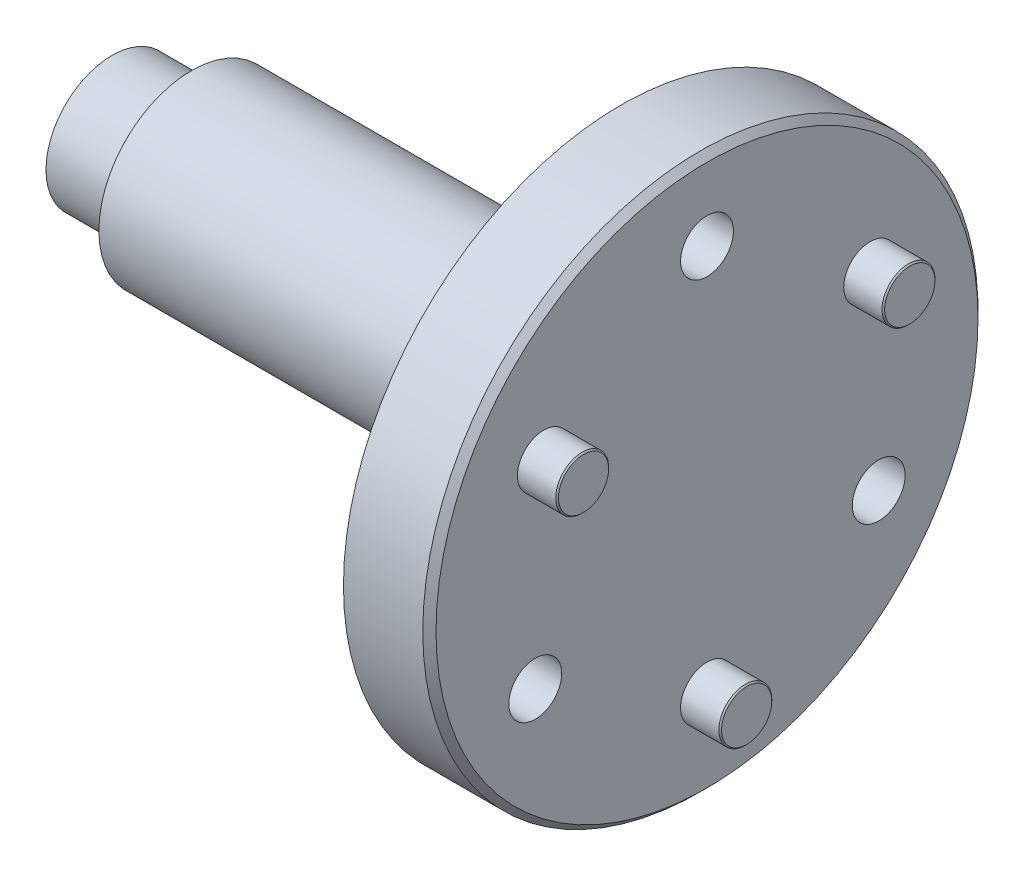
ISO-10303-21;
HEADER;
FILE_DESCRIPTION(('STEP AP214'),'2;1');
FILE_NAME('part.step','',(''),(''),'','','');
FILE_SCHEMA(('AUTOMOTIVE_DESIGN { 1 0 10303 214 1 1 1 1 }'));
ENDSEC;
DATA;
#1=APPLICATION_CONTEXT('core data for automotive mechanical design processes');
#2=APPLICATION_PROTOCOL_DEFINITION('international standard','automotive_design',2000,#1);
#3=PRODUCT_CONTEXT('',#1,'mechanical');
#4=PRODUCT('Part','Part','',(#3));
#5=PRODUCT_RELATED_PRODUCT_CATEGORY('part','',(#4));
#6=PRODUCT_DEFINITION_FORMATION('','',#4);
#7=PRODUCT_DEFINITION_CONTEXT('part definition',#1,'design');
#8=PRODUCT_DEFINITION('design','',#6,#7);
#9=PRODUCT_DEFINITION_SHAPE('','',#8);
#10=(LENGTH_UNIT() NAMED_UNIT(*) SI_UNIT(.MILLI.,.METRE.));
#11=(NAMED_UNIT(*) PLANE_ANGLE_UNIT() SI_UNIT($,.RADIAN.));
#12=(NAMED_UNIT(*) SI_UNIT($,.STERADIAN.) SOLID_ANGLE_UNIT());
#13=UNCERTAINTY_MEASURE_WITH_UNIT(LENGTH_MEASURE(1.E-05),#10,'distance_accuracy_value','');
#14=(GEOMETRIC_REPRESENTATION_CONTEXT(3) GLOBAL_UNCERTAINTY_ASSIGNED_CONTEXT((#13)) GLOBAL_UNIT_ASSIGNED_CONTEXT((#10,
#11,#12)) REPRESENTATION_CONTEXT('',''));
#15=CARTESIAN_POINT('',(0.,0.,0.));
#16=DIRECTION('',(0.,0.,1.));
#17=DIRECTION('',(1.,0.,0.));
#18=AXIS2_PLACEMENT_3D('',#15,#16,#17);
#19=CARTESIAN_POINT('',(-22.25,0.,0.));
#20=DIRECTION('',(1.,0.,0.));
#21=DIRECTION('',(0.,0.,-1.));
#22=AXIS2_PLACEMENT_3D('',#19,#20,#21);
#23=PLANE('',#22);
#24=CARTESIAN_POINT('',(-22.25,0.,0.));
#25=DIRECTION('',(-1.,0.,0.));
#26=DIRECTION('',(0.,0.,1.));
#27=AXIS2_PLACEMENT_3D('',#24,#25,#26);
#28=CIRCLE('',#27,5.);
#29=CARTESIAN_POINT('',(-22.25,0.,5.));
#30=VERTEX_POINT('',#29);
#31=EDGE_CURVE('E100',#30,#30,#28,.T.);
#32=ORIENTED_EDGE('',*,*,#31,.T.);
#33=EDGE_LOOP('',(#32));
#34=FACE_BOUND('',#33,.T.);
#35=ADVANCED_FACE('F45',(#34),#23,.F.);
#36=CARTESIAN_POINT('',(-54.0782024571697,0.,0.));
#37=DIRECTION('',(-1.,0.,0.));
#38=DIRECTION('',(0.,0.,1.));
#39=AXIS2_PLACEMENT_3D('',#36,#37,#38);
#40=CYLINDRICAL_SURFACE('',#39,5.);
#41=ORIENTED_EDGE('',*,*,#31,.F.);
#42=EDGE_LOOP('',(#41));
#43=FACE_BOUND('',#42,.T.);
#44=CARTESIAN_POINT('',(-16.25,0.,0.));
#45=DIRECTION('',(-1.,0.,0.));
#46=DIRECTION('',(0.,0.,1.));
#47=AXIS2_PLACEMENT_3D('',#44,#45,#46);
#48=CIRCLE('',#47,5.);
#49=CARTESIAN_POINT('',(-16.25,0.,5.));
#50=VERTEX_POINT('',#49);
#51=EDGE_CURVE('E104',#50,#50,#48,.T.);
#52=ORIENTED_EDGE('',*,*,#51,.T.);
#53=EDGE_LOOP('',(#52));
#54=FACE_BOUND('',#53,.T.);
#55=ADVANCED_FACE('F182',(#43,#54),#40,.T.);
#56=CARTESIAN_POINT('',(-16.25,5.,0.));
#57=DIRECTION('',(1.,0.,0.));
#58=DIRECTION('',(0.,0.,-1.));
#59=AXIS2_PLACEMENT_3D('',#56,#57,#58);
#60=PLANE('',#59);
#61=ORIENTED_EDGE('',*,*,#51,.F.);
#62=EDGE_LOOP('',(#61));
#63=FACE_BOUND('',#62,.T.);
#64=CARTESIAN_POINT('',(-16.25,0.,0.));
#65=DIRECTION('',(-1.,0.,0.));
#66=DIRECTION('',(0.,0.,1.));
#67=AXIS2_PLACEMENT_3D('',#64,#65,#66);
#68=CIRCLE('',#67,7.);
#69=CARTESIAN_POINT('',(-16.25,0.,7.));
#70=VERTEX_POINT('',#69);
#71=EDGE_CURVE('E108',#70,#70,#68,.T.);
#72=ORIENTED_EDGE('',*,*,#71,.T.);
#73=EDGE_LOOP('',(#72));
#74=FACE_BOUND('',#73,.T.);
#75=ADVANCED_FACE('F176',(#63,#74),#60,.F.);
#76=CARTESIAN_POINT('',(-54.0782024571697,0.,0.));
#77=DIRECTION('',(-1.,0.,0.));
#78=DIRECTION('',(0.,0.,1.));
#79=AXIS2_PLACEMENT_3D('',#76,#77,#78);
#80=CYLINDRICAL_SURFACE('',#79,7.);
#81=ORIENTED_EDGE('',*,*,#71,.F.);
#82=EDGE_LOOP('',(#81));
#83=FACE_BOUND('',#82,.T.);
#84=CARTESIAN_POINT('',(16.25,0.,0.));
#85=DIRECTION('',(-1.,0.,0.));
#86=DIRECTION('',(0.,0.,1.));
#87=AXIS2_PLACEMENT_3D('',#84,#85,#86);
#88=CIRCLE('',#87,7.);
#89=CARTESIAN_POINT('',(16.25,0.,7.));
#90=VERTEX_POINT('',#89);
#91=EDGE_CURVE('E111',#90,#90,#88,.T.);
#92=ORIENTED_EDGE('',*,*,#91,.T.);
#93=EDGE_LOOP('',(#92));
#94=FACE_BOUND('',#93,.T.);
#95=ADVANCED_FACE('F171',(#83,#94),#80,.T.);
#96=CARTESIAN_POINT('',(16.25,7.,0.));
#97=DIRECTION('',(1.,0.,0.));
#98=DIRECTION('',(0.,0.,-1.));
#99=AXIS2_PLACEMENT_3D('',#96,#97,#98);
#100=PLANE('',#99);
#101=CARTESIAN_POINT('',(16.25,-7.50000000000006,-12.9903810567665));
#102=DIRECTION('',(1.,0.,0.));
#103=DIRECTION('',(0.,0.,-1.));
#104=AXIS2_PLACEMENT_3D('',#101,#102,#103);
#105=CIRCLE('',#104,2.);
#106=CARTESIAN_POINT('',(16.25,-7.50000000000006,-14.9903810567665));
#107=VERTEX_POINT('',#106);
#108=EDGE_CURVE('E126',#107,#107,#105,.F.);
#109=ORIENTED_EDGE('',*,*,#108,.F.);
#110=EDGE_LOOP('',(#109));
#111=FACE_BOUND('',#110,.T.);
#112=CARTESIAN_POINT('',(16.25,-7.49999999999988,12.9903810567666));
#113=DIRECTION('',(1.,0.,0.));
#114=DIRECTION('',(0.,0.,-1.));
#115=AXIS2_PLACEMENT_3D('',#112,#113,#114);
#116=CIRCLE('',#115,2.);
#117=CARTESIAN_POINT('',(16.25,-7.49999999999988,10.9903810567666));
#118=VERTEX_POINT('',#117);
#119=EDGE_CURVE('E127',#118,#118,#116,.F.);
#120=ORIENTED_EDGE('',*,*,#119,.F.);
#121=EDGE_LOOP('',(#120));
#122=FACE_BOUND('',#121,.T.);
#123=CARTESIAN_POINT('',(16.25,15.,0.));
#124=DIRECTION('',(1.,0.,0.));
#125=DIRECTION('',(0.,0.,-1.));
#126=AXIS2_PLACEMENT_3D('',#123,#124,#125);
#127=CIRCLE('',#126,2.);
#128=CARTESIAN_POINT('',(16.25,15.,-2.));
#129=VERTEX_POINT('',#128);
#130=EDGE_CURVE('E119',#129,#129,#127,.F.);
#131=ORIENTED_EDGE('',*,*,#130,.F.);
#132=EDGE_LOOP('',(#131));
#133=FACE_BOUND('',#132,.T.);
#134=ORIENTED_EDGE('',*,*,#91,.F.);
#135=EDGE_LOOP('',(#134));
#136=FACE_BOUND('',#135,.T.);
#137=CARTESIAN_POINT('',(16.25,0.,0.));
#138=DIRECTION('',(-1.,0.,0.));
#139=DIRECTION('',(0.,0.,1.));
#140=AXIS2_PLACEMENT_3D('',#137,#138,#139);
#141=CIRCLE('',#140,21.);
#142=CARTESIAN_POINT('',(16.25,0.,21.));
#143=VERTEX_POINT('',#142);
#144=EDGE_CURVE('E115',#143,#143,#141,.T.);
#145=ORIENTED_EDGE('',*,*,#144,.T.);
#146=EDGE_LOOP('',(#145));
#147=FACE_BOUND('',#146,.T.);
#148=ADVANCED_FACE('F166',(#111,#122,#133,#136,#147),#100,.F.);
#149=CARTESIAN_POINT('',(-54.0782024571697,0.,0.));
#150=DIRECTION('',(-1.,0.,0.));
#151=DIRECTION('',(0.,0.,1.));
#152=AXIS2_PLACEMENT_3D('',#149,#150,#151);
#153=CYLINDRICAL_SURFACE('',#152,21.);
#154=CARTESIAN_POINT('',(22.25,0.,0.));
#155=DIRECTION('',(-1.,0.,0.));
#156=DIRECTION('',(0.,0.,1.));
#157=AXIS2_PLACEMENT_3D('',#154,#155,#156);
#158=CIRCLE('',#157,21.);
#159=CARTESIAN_POINT('',(22.25,0.,21.));
#160=VERTEX_POINT('',#159);
#161=EDGE_CURVE('E96',#160,#160,#158,.T.);
#162=ORIENTED_EDGE('',*,*,#161,.T.);
#163=EDGE_LOOP('',(#162));
#164=FACE_BOUND('',#163,.T.);
#165=ORIENTED_EDGE('',*,*,#144,.F.);
#166=EDGE_LOOP('',(#165));
#167=FACE_BOUND('',#166,.T.);
#168=ADVANCED_FACE('F149',(#164,#167),#153,.T.);
#169=CARTESIAN_POINT('',(22.75,21.,0.));
#170=DIRECTION('',(-1.,0.,0.));
#171=DIRECTION('',(0.,0.,1.));
#172=AXIS2_PLACEMENT_3D('',#169,#170,#171);
#173=PLANE('',#172);
#174=CARTESIAN_POINT('',(22.75,-14.25,-2.02095284951298E-13));
#175=DIRECTION('',(-1.,0.,0.));
#176=DIRECTION('',(0.,0.,1.));
#177=AXIS2_PLACEMENT_3D('',#174,#175,#176);
#178=CIRCLE('',#177,2.);
#179=CARTESIAN_POINT('',(22.75,-14.25,1.9999999999998));
#180=VERTEX_POINT('',#179);
#181=EDGE_CURVE('E74',#180,#180,#178,.F.);
#182=ORIENTED_EDGE('',*,*,#181,.F.);
#183=EDGE_LOOP('',(#182));
#184=FACE_BOUND('',#183,.T.);
#185=CARTESIAN_POINT('',(22.75,7.12499999999988,12.3408620039283));
#186=DIRECTION('',(-1.,0.,0.));
#187=DIRECTION('',(0.,0.,1.));
#188=AXIS2_PLACEMENT_3D('',#185,#186,#187);
#189=CIRCLE('',#188,2.);
#190=CARTESIAN_POINT('',(22.75,7.12499999999988,14.3408620039283));
#191=VERTEX_POINT('',#190);
#192=EDGE_CURVE('E78',#191,#191,#189,.F.);
#193=ORIENTED_EDGE('',*,*,#192,.F.);
#194=EDGE_LOOP('',(#193));
#195=FACE_BOUND('',#194,.T.);
#196=CARTESIAN_POINT('',(22.75,7.12500000000006,-12.3408620039282));
#197=DIRECTION('',(-1.,0.,0.));
#198=DIRECTION('',(0.,0.,1.));
#199=AXIS2_PLACEMENT_3D('',#196,#197,#198);
#200=CIRCLE('',#199,2.);
#201=CARTESIAN_POINT('',(22.75,7.12500000000006,-10.3408620039282));
#202=VERTEX_POINT('',#201);
#203=EDGE_CURVE('E88',#202,#202,#200,.F.);
#204=ORIENTED_EDGE('',*,*,#203,.F.);
#205=EDGE_LOOP('',(#204));
#206=FACE_BOUND('',#205,.T.);
#207=CARTESIAN_POINT('',(22.75,-7.50000000000006,-12.9903810567665));
#208=DIRECTION('',(1.,0.,0.));
#209=DIRECTION('',(0.,-0.866025403784436,0.500000000000004));
#210=AXIS2_PLACEMENT_3D('',#207,#208,#209);
#211=CIRCLE('',#210,2.);
#212=CARTESIAN_POINT('',(22.75,-9.23205080756893,-11.9903810567665));
#213=VERTEX_POINT('',#212);
#214=EDGE_CURVE('E131',#213,#213,#211,.T.);
#215=ORIENTED_EDGE('',*,*,#214,.F.);
#216=EDGE_LOOP('',(#215));
#217=FACE_BOUND('',#216,.T.);
#218=CARTESIAN_POINT('',(22.75,-7.49999999999988,12.9903810567666));
#219=DIRECTION('',(1.,0.,0.));
#220=DIRECTION('',(0.,0.866025403784443,0.499999999999992));
#221=AXIS2_PLACEMENT_3D('',#218,#219,#220);
#222=CIRCLE('',#221,2.);
#223=CARTESIAN_POINT('',(22.75,-5.76794919243099,13.9903810567666));
#224=VERTEX_POINT('',#223);
#225=EDGE_CURVE('E132',#224,#224,#222,.T.);
#226=ORIENTED_EDGE('',*,*,#225,.F.);
#227=EDGE_LOOP('',(#226));
#228=FACE_BOUND('',#227,.T.);
#229=CARTESIAN_POINT('',(22.75,15.,0.));
#230=DIRECTION('',(1.,0.,0.));
#231=DIRECTION('',(0.,0.,-1.));
#232=AXIS2_PLACEMENT_3D('',#229,#230,#231);
#233=CIRCLE('',#232,2.);
#234=CARTESIAN_POINT('',(22.75,15.,-2.));
#235=VERTEX_POINT('',#234);
#236=EDGE_CURVE('E123',#235,#235,#233,.T.);
#237=ORIENTED_EDGE('',*,*,#236,.F.);
#238=EDGE_LOOP('',(#237));
#239=FACE_BOUND('',#238,.T.);
#240=CARTESIAN_POINT('',(22.75,0.,0.));
#241=DIRECTION('',(-1.,0.,0.));
#242=DIRECTION('',(0.,0.,1.));
#243=AXIS2_PLACEMENT_3D('',#240,#241,#242);
#244=CIRCLE('',#243,20.5);
#245=CARTESIAN_POINT('',(22.75,0.,20.5));
#246=VERTEX_POINT('',#245);
#247=EDGE_CURVE('E92',#246,#246,#244,.F.);
#248=ORIENTED_EDGE('',*,*,#247,.T.);
#249=EDGE_LOOP('',(#248));
#250=FACE_BOUND('',#249,.T.);
#251=ADVANCED_FACE('F145',(#184,#195,#206,#217,#228,#239,#250),#173,.F.);
#252=CARTESIAN_POINT('',(22.25,0.,0.));
#253=DIRECTION('',(-1.,0.,0.));
#254=DIRECTION('',(0.,0.,1.));
#255=AXIS2_PLACEMENT_3D('',#252,#253,#254);
#256=CONICAL_SURFACE('',#255,21.,0.785398163397448);
#257=ORIENTED_EDGE('',*,*,#247,.F.);
#258=EDGE_LOOP('',(#257));
#259=FACE_BOUND('',#258,.T.);
#260=ORIENTED_EDGE('',*,*,#161,.F.);
#261=EDGE_LOOP('',(#260));
#262=FACE_BOUND('',#261,.T.);
#263=ADVANCED_FACE('F148',(#259,#262),#256,.T.);
#264=CARTESIAN_POINT('',(10.5931457505076,15.,0.));
#265=DIRECTION('',(1.,0.,0.));
#266=DIRECTION('',(0.,0.,-1.));
#267=AXIS2_PLACEMENT_3D('',#264,#265,#266);
#268=CYLINDRICAL_SURFACE('',#267,2.);
#269=ORIENTED_EDGE('',*,*,#130,.T.);
#270=EDGE_LOOP('',(#269));
#271=FACE_BOUND('',#270,.T.);
#272=ORIENTED_EDGE('',*,*,#236,.T.);
#273=EDGE_LOOP('',(#272));
#274=FACE_BOUND('',#273,.T.);
#275=ADVANCED_FACE('F160',(#271,#274),#268,.F.);
#276=CARTESIAN_POINT('',(10.5931457505076,-7.49999999999988,12.9903810567666));
#277=DIRECTION('',(1.,0.,0.));
#278=DIRECTION('',(0.,0.,-1.));
#279=AXIS2_PLACEMENT_3D('',#276,#277,#278);
#280=CYLINDRICAL_SURFACE('',#279,2.);
#281=ORIENTED_EDGE('',*,*,#119,.T.);
#282=EDGE_LOOP('',(#281));
#283=FACE_BOUND('',#282,.T.);
#284=ORIENTED_EDGE('',*,*,#225,.T.);
#285=EDGE_LOOP('',(#284));
#286=FACE_BOUND('',#285,.T.);
#287=ADVANCED_FACE('F238',(#283,#286),#280,.F.);
#288=CARTESIAN_POINT('',(10.5931457505076,-7.50000000000006,-12.9903810567665));
#289=DIRECTION('',(1.,0.,0.));
#290=DIRECTION('',(0.,0.,-1.));
#291=AXIS2_PLACEMENT_3D('',#288,#289,#290);
#292=CYLINDRICAL_SURFACE('',#291,2.);
#293=ORIENTED_EDGE('',*,*,#108,.T.);
#294=EDGE_LOOP('',(#293));
#295=FACE_BOUND('',#294,.T.);
#296=ORIENTED_EDGE('',*,*,#214,.T.);
#297=EDGE_LOOP('',(#296));
#298=FACE_BOUND('',#297,.T.);
#299=ADVANCED_FACE('F143',(#295,#298),#292,.F.);
#300=CARTESIAN_POINT('',(25.75,7.12500000000006,-12.3408620039282));
#301=DIRECTION('',(-1.,0.,0.));
#302=DIRECTION('',(0.,0.,1.));
#303=AXIS2_PLACEMENT_3D('',#300,#301,#302);
#304=CYLINDRICAL_SURFACE('',#303,2.);
#305=CARTESIAN_POINT('',(25.65,7.12500000000006,-12.3408620039282));
#306=DIRECTION('',(1.,0.,0.));
#307=DIRECTION('',(0.,0.,-1.));
#308=AXIS2_PLACEMENT_3D('',#305,#306,#307);
#309=CIRCLE('',#308,2.);
#310=CARTESIAN_POINT('',(25.65,7.12500000000006,-14.3408620039282));
#311=VERTEX_POINT('',#310);
#312=EDGE_CURVE('E82',#311,#311,#309,.F.);
#313=ORIENTED_EDGE('',*,*,#312,.T.);
#314=EDGE_LOOP('',(#313));
#315=FACE_BOUND('',#314,.T.);
#316=ORIENTED_EDGE('',*,*,#203,.T.);
#317=EDGE_LOOP('',(#316));
#318=FACE_BOUND('',#317,.T.);
#319=ADVANCED_FACE('F231',(#315,#318),#304,.T.);
#320=CARTESIAN_POINT('',(25.75,7.12500000000006,-12.3408620039282));
#321=DIRECTION('',(1.,0.,0.));
#322=DIRECTION('',(0.,0.,-1.));
#323=AXIS2_PLACEMENT_3D('',#320,#321,#322);
#324=PLANE('',#323);
#325=CARTESIAN_POINT('',(25.75,7.12500000000006,-12.3408620039282));
#326=DIRECTION('',(1.,0.,0.));
#327=DIRECTION('',(0.,0.,-1.));
#328=AXIS2_PLACEMENT_3D('',#325,#326,#327);
#329=CIRCLE('',#328,1.90000000000001);
#330=CARTESIAN_POINT('',(25.75,7.12500000000006,-14.2408620039282));
#331=VERTEX_POINT('',#330);
#332=EDGE_CURVE('E85',#331,#331,#329,.T.);
#333=ORIENTED_EDGE('',*,*,#332,.T.);
#334=EDGE_LOOP('',(#333));
#335=FACE_BOUND('',#334,.T.);
#336=ADVANCED_FACE('F201',(#335),#324,.T.);
#337=CARTESIAN_POINT('',(25.75,7.12500000000006,-12.3408620039282));
#338=DIRECTION('',(-1.,0.,0.));
#339=DIRECTION('',(0.,0.,1.));
#340=AXIS2_PLACEMENT_3D('',#337,#338,#339);
#341=CONICAL_SURFACE('',#340,1.90000000000001,0.78539816339749);
#342=ORIENTED_EDGE('',*,*,#312,.F.);
#343=EDGE_LOOP('',(#342));
#344=FACE_BOUND('',#343,.T.);
#345=ORIENTED_EDGE('',*,*,#332,.F.);
#346=EDGE_LOOP('',(#345));
#347=FACE_BOUND('',#346,.T.);
#348=ADVANCED_FACE('F195',(#344,#347),#341,.T.);
#349=CARTESIAN_POINT('',(25.75,7.12499999999988,12.3408620039283));
#350=DIRECTION('',(-1.,0.,0.));
#351=DIRECTION('',(0.,0.,1.));
#352=AXIS2_PLACEMENT_3D('',#349,#350,#351);
#353=CYLINDRICAL_SURFACE('',#352,2.);
#354=CARTESIAN_POINT('',(25.65,7.12499999999988,12.3408620039283));
#355=DIRECTION('',(1.,0.,0.));
#356=DIRECTION('',(0.,0.,-1.));
#357=AXIS2_PLACEMENT_3D('',#354,#355,#356);
#358=CIRCLE('',#357,2.);
#359=CARTESIAN_POINT('',(25.65,7.12499999999988,10.3408620039283));
#360=VERTEX_POINT('',#359);
#361=EDGE_CURVE('E61',#360,#360,#358,.F.);
#362=ORIENTED_EDGE('',*,*,#361,.T.);
#363=EDGE_LOOP('',(#362));
#364=FACE_BOUND('',#363,.T.);
#365=ORIENTED_EDGE('',*,*,#192,.T.);
#366=EDGE_LOOP('',(#365));
#367=FACE_BOUND('',#366,.T.);
#368=ADVANCED_FACE('F200',(#364,#367),#353,.T.);
#369=CARTESIAN_POINT('',(25.75,7.12499999999988,12.3408620039283));
#370=DIRECTION('',(1.,0.,0.));
#371=DIRECTION('',(0.,0.866025403784436,0.500000000000004));
#372=AXIS2_PLACEMENT_3D('',#369,#370,#371);
#373=PLANE('',#372);
#374=CARTESIAN_POINT('',(25.75,7.12499999999988,12.3408620039283));
#375=DIRECTION('',(1.,0.,0.));
#376=DIRECTION('',(0.,0.,-1.));
#377=AXIS2_PLACEMENT_3D('',#374,#375,#376);
#378=CIRCLE('',#377,1.90000000000001);
#379=CARTESIAN_POINT('',(25.75,7.12499999999988,10.4408620039283));
#380=VERTEX_POINT('',#379);
#381=EDGE_CURVE('E68',#380,#380,#378,.T.);
#382=ORIENTED_EDGE('',*,*,#381,.T.);
#383=EDGE_LOOP('',(#382));
#384=FACE_BOUND('',#383,.T.);
#385=ADVANCED_FACE('F219',(#384),#373,.T.);
#386=CARTESIAN_POINT('',(25.75,-14.25,-2.02095284951298E-13));
#387=DIRECTION('',(-1.,0.,0.));
#388=DIRECTION('',(0.,0.,1.));
#389=AXIS2_PLACEMENT_3D('',#386,#387,#388);
#390=CYLINDRICAL_SURFACE('',#389,2.);
#391=CARTESIAN_POINT('',(25.65,-14.25,-2.02095284951298E-13));
#392=DIRECTION('',(1.,0.,0.));
#393=DIRECTION('',(0.,0.,-1.));
#394=AXIS2_PLACEMENT_3D('',#391,#392,#393);
#395=CIRCLE('',#394,2.);
#396=CARTESIAN_POINT('',(25.65,-14.25,-2.0000000000002));
#397=VERTEX_POINT('',#396);
#398=EDGE_CURVE('E10',#397,#397,#395,.F.);
#399=ORIENTED_EDGE('',*,*,#398,.T.);
#400=EDGE_LOOP('',(#399));
#401=FACE_BOUND('',#400,.T.);
#402=ORIENTED_EDGE('',*,*,#181,.T.);
#403=EDGE_LOOP('',(#402));
#404=FACE_BOUND('',#403,.T.);
#405=ADVANCED_FACE('F213',(#401,#404),#390,.T.);
#406=CARTESIAN_POINT('',(25.75,-14.25,-2.02095284951298E-13));
#407=DIRECTION('',(1.,0.,0.));
#408=DIRECTION('',(0.,-0.866025403784443,0.499999999999992));
#409=AXIS2_PLACEMENT_3D('',#406,#407,#408);
#410=PLANE('',#409);
#411=CARTESIAN_POINT('',(25.75,-14.25,-2.02095284951298E-13));
#412=DIRECTION('',(1.,0.,0.));
#413=DIRECTION('',(0.,0.,-1.));
#414=AXIS2_PLACEMENT_3D('',#411,#412,#413);
#415=CIRCLE('',#414,1.90000000000001);
#416=CARTESIAN_POINT('',(25.75,-14.25,-1.90000000000021));
#417=VERTEX_POINT('',#416);
#418=EDGE_CURVE('E54',#417,#417,#415,.T.);
#419=ORIENTED_EDGE('',*,*,#418,.T.);
#420=EDGE_LOOP('',(#419));
#421=FACE_BOUND('',#420,.T.);
#422=ADVANCED_FACE('F207',(#421),#410,.T.);
#423=CARTESIAN_POINT('',(25.75,7.12499999999988,12.3408620039283));
#424=DIRECTION('',(-1.,0.,0.));
#425=DIRECTION('',(0.,0.,1.));
#426=AXIS2_PLACEMENT_3D('',#423,#424,#425);
#427=CONICAL_SURFACE('',#426,1.90000000000001,0.78539816339747);
#428=ORIENTED_EDGE('',*,*,#361,.F.);
#429=EDGE_LOOP('',(#428));
#430=FACE_BOUND('',#429,.T.);
#431=ORIENTED_EDGE('',*,*,#381,.F.);
#432=EDGE_LOOP('',(#431));
#433=FACE_BOUND('',#432,.T.);
#434=ADVANCED_FACE('F203',(#430,#433),#427,.T.);
#435=CARTESIAN_POINT('',(25.75,-14.25,-2.02095284951298E-13));
#436=DIRECTION('',(-1.,0.,0.));
#437=DIRECTION('',(0.,0.,1.));
#438=AXIS2_PLACEMENT_3D('',#435,#436,#437);
#439=CONICAL_SURFACE('',#438,1.90000000000001,0.785398163397435);
#440=ORIENTED_EDGE('',*,*,#398,.F.);
#441=EDGE_LOOP('',(#440));
#442=FACE_BOUND('',#441,.T.);
#443=ORIENTED_EDGE('',*,*,#418,.F.);
#444=EDGE_LOOP('',(#443));
#445=FACE_BOUND('',#444,.T.);
#446=ADVANCED_FACE('F48',(#442,#445),#439,.T.);
#447=CLOSED_SHELL('',(#35,#55,#75,#95,#148,#168,#251,#263,#275,#287,#299,#319,#336,#348,#368,
#385,#405,#422,#434,#446));
#448=MANIFOLD_SOLID_BREP('B2',#447);
#449=ADVANCED_BREP_SHAPE_REPRESENTATION('',(#18,#448),#14);
#450=SHAPE_DEFINITION_REPRESENTATION(#9,#449);
ENDSEC;
END-ISO-10303-21;
